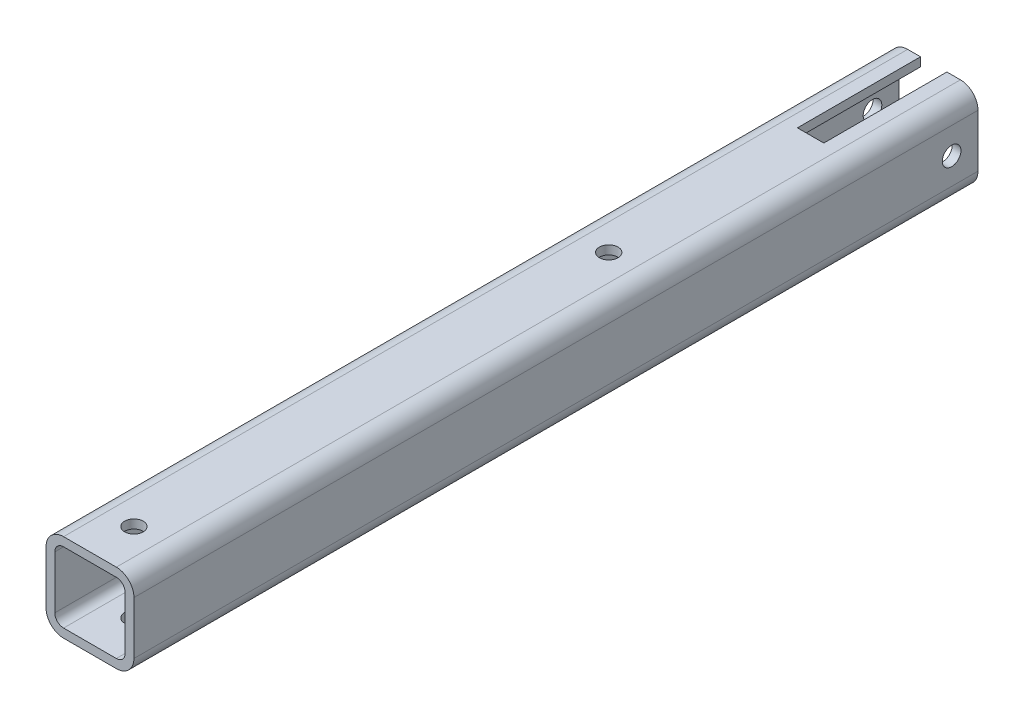
ISO-10303-21;
HEADER;
FILE_DESCRIPTION(('STEP AP214'),'2;1');
FILE_NAME('part.step','',(''),(''),'','','');
FILE_SCHEMA(('AUTOMOTIVE_DESIGN { 1 0 10303 214 1 1 1 1 }'));
ENDSEC;
DATA;
#1=APPLICATION_CONTEXT('core data for automotive mechanical design processes');
#2=APPLICATION_PROTOCOL_DEFINITION('international standard','automotive_design',2000,#1);
#3=PRODUCT_CONTEXT('',#1,'mechanical');
#4=PRODUCT('Part','Part','',(#3));
#5=PRODUCT_RELATED_PRODUCT_CATEGORY('part','',(#4));
#6=PRODUCT_DEFINITION_FORMATION('','',#4);
#7=PRODUCT_DEFINITION_CONTEXT('part definition',#1,'design');
#8=PRODUCT_DEFINITION('design','',#6,#7);
#9=PRODUCT_DEFINITION_SHAPE('','',#8);
#10=(LENGTH_UNIT() NAMED_UNIT(*) SI_UNIT(.MILLI.,.METRE.));
#11=(NAMED_UNIT(*) PLANE_ANGLE_UNIT() SI_UNIT($,.RADIAN.));
#12=(NAMED_UNIT(*) SI_UNIT($,.STERADIAN.) SOLID_ANGLE_UNIT());
#13=UNCERTAINTY_MEASURE_WITH_UNIT(LENGTH_MEASURE(1.E-05),#10,'distance_accuracy_value','');
#14=(GEOMETRIC_REPRESENTATION_CONTEXT(3) GLOBAL_UNCERTAINTY_ASSIGNED_CONTEXT((#13)) GLOBAL_UNIT_ASSIGNED_CONTEXT((#10,
#11,#12)) REPRESENTATION_CONTEXT('',''));
#15=CARTESIAN_POINT('',(0.,0.,0.));
#16=DIRECTION('',(0.,0.,1.));
#17=DIRECTION('',(1.,0.,0.));
#18=AXIS2_PLACEMENT_3D('',#15,#16,#17);
#19=CARTESIAN_POINT('',(15.875,0.,9.525));
#20=DIRECTION('',(1.,0.,0.));
#21=DIRECTION('',(0.,0.,-1.));
#22=AXIS2_PLACEMENT_3D('',#19,#20,#21);
#23=CYLINDRICAL_SURFACE('',#22,3.3655);
#24=CARTESIAN_POINT('',(12.7,0.,9.525));
#25=DIRECTION('',(1.,0.,0.));
#26=DIRECTION('',(0.,0.,-1.));
#27=AXIS2_PLACEMENT_3D('',#24,#25,#26);
#28=CIRCLE('',#27,3.3655);
#29=CARTESIAN_POINT('',(12.7,0.,6.1595));
#30=VERTEX_POINT('',#29);
#31=EDGE_CURVE('E298',#30,#30,#28,.F.);
#32=ORIENTED_EDGE('',*,*,#31,.T.);
#33=EDGE_LOOP('',(#32));
#34=FACE_BOUND('',#33,.T.);
#35=CARTESIAN_POINT('',(15.875,0.,9.525));
#36=DIRECTION('',(1.,0.,0.));
#37=DIRECTION('',(0.,0.,-1.));
#38=AXIS2_PLACEMENT_3D('',#35,#36,#37);
#39=CIRCLE('',#38,3.3655);
#40=CARTESIAN_POINT('',(15.875,0.,6.1595));
#41=VERTEX_POINT('',#40);
#42=EDGE_CURVE('E301',#41,#41,#39,.F.);
#43=ORIENTED_EDGE('',*,*,#42,.F.);
#44=EDGE_LOOP('',(#43));
#45=FACE_BOUND('',#44,.T.);
#46=ADVANCED_FACE('F16',(#34,#45),#23,.F.);
#47=CARTESIAN_POINT('',(4.63962226725964,15.875,44.45));
#48=DIRECTION('',(1.,0.,0.));
#49=DIRECTION('',(0.,0.,-1.));
#50=AXIS2_PLACEMENT_3D('',#47,#48,#49);
#51=PLANE('',#50);
#52=DIRECTION('',(0.,0.,1.));
#53=VECTOR('',#52,1.);
#54=CARTESIAN_POINT('',(4.63962226725964,12.7,0.));
#55=LINE('',#54,#53);
#56=CARTESIAN_POINT('',(4.63962226725964,12.7,0.));
#57=VERTEX_POINT('',#56);
#58=CARTESIAN_POINT('',(4.63962226725964,12.7,44.45));
#59=VERTEX_POINT('',#58);
#60=EDGE_CURVE('E272',#57,#59,#55,.T.);
#61=ORIENTED_EDGE('',*,*,#60,.T.);
#62=DIRECTION('',(0.,1.,0.));
#63=VECTOR('',#62,1.);
#64=CARTESIAN_POINT('',(4.63962226725964,15.875,44.45));
#65=LINE('',#64,#63);
#66=CARTESIAN_POINT('',(4.63962226725964,15.875,44.45));
#67=VERTEX_POINT('',#66);
#68=EDGE_CURVE('E253',#59,#67,#65,.T.);
#69=ORIENTED_EDGE('',*,*,#68,.T.);
#70=DIRECTION('',(0.,0.,1.));
#71=VECTOR('',#70,1.);
#72=CARTESIAN_POINT('',(4.63962226725964,15.875,0.));
#73=LINE('',#72,#71);
#74=CARTESIAN_POINT('',(4.63962226725964,15.875,0.));
#75=VERTEX_POINT('',#74);
#76=EDGE_CURVE('E248',#75,#67,#73,.T.);
#77=ORIENTED_EDGE('',*,*,#76,.F.);
#78=DIRECTION('',(0.,1.,0.));
#79=VECTOR('',#78,1.);
#80=CARTESIAN_POINT('',(4.63962226725964,0.,0.));
#81=LINE('',#80,#79);
#82=EDGE_CURVE('E237',#75,#57,#81,.F.);
#83=ORIENTED_EDGE('',*,*,#82,.T.);
#84=EDGE_LOOP('',(#61,#69,#77,#83));
#85=FACE_BOUND('',#84,.T.);
#86=ADVANCED_FACE('F386',(#85),#51,.F.);
#87=CARTESIAN_POINT('',(-4.88537773274036,15.875,44.45));
#88=DIRECTION('',(0.,0.,1.));
#89=DIRECTION('',(1.,0.,0.));
#90=AXIS2_PLACEMENT_3D('',#87,#88,#89);
#91=PLANE('',#90);
#92=ORIENTED_EDGE('',*,*,#68,.F.);
#93=DIRECTION('',(1.,0.,0.));
#94=VECTOR('',#93,1.);
#95=CARTESIAN_POINT('',(15.875,12.7,44.45));
#96=LINE('',#95,#94);
#97=CARTESIAN_POINT('',(-4.88537773274036,12.7,44.45));
#98=VERTEX_POINT('',#97);
#99=EDGE_CURVE('E269',#59,#98,#96,.F.);
#100=ORIENTED_EDGE('',*,*,#99,.T.);
#101=DIRECTION('',(0.,1.,0.));
#102=VECTOR('',#101,1.);
#103=CARTESIAN_POINT('',(-4.88537773274036,15.875,44.45));
#104=LINE('',#103,#102);
#105=CARTESIAN_POINT('',(-4.88537773274036,15.875,44.45));
#106=VERTEX_POINT('',#105);
#107=EDGE_CURVE('E260',#98,#106,#104,.T.);
#108=ORIENTED_EDGE('',*,*,#107,.T.);
#109=DIRECTION('',(1.,0.,0.));
#110=VECTOR('',#109,1.);
#111=CARTESIAN_POINT('',(15.875,15.875,44.45));
#112=LINE('',#111,#110);
#113=EDGE_CURVE('E257',#67,#106,#112,.F.);
#114=ORIENTED_EDGE('',*,*,#113,.F.);
#115=EDGE_LOOP('',(#92,#100,#108,#114));
#116=FACE_BOUND('',#115,.T.);
#117=ADVANCED_FACE('F392',(#116),#91,.F.);
#118=CARTESIAN_POINT('',(0.,15.875,288.925));
#119=DIRECTION('',(0.,1.,0.));
#120=DIRECTION('',(0.,0.,1.));
#121=AXIS2_PLACEMENT_3D('',#118,#119,#120);
#122=CYLINDRICAL_SURFACE('',#121,3.3655);
#123=CARTESIAN_POINT('',(0.,12.7,288.925));
#124=DIRECTION('',(0.,1.,0.));
#125=DIRECTION('',(0.,0.,1.));
#126=AXIS2_PLACEMENT_3D('',#123,#124,#125);
#127=CIRCLE('',#126,3.3655);
#128=CARTESIAN_POINT('',(0.,12.7,292.2905));
#129=VERTEX_POINT('',#128);
#130=EDGE_CURVE('E271',#129,#129,#127,.F.);
#131=ORIENTED_EDGE('',*,*,#130,.T.);
#132=EDGE_LOOP('',(#131));
#133=FACE_BOUND('',#132,.T.);
#134=CARTESIAN_POINT('',(0.,15.875,288.925));
#135=DIRECTION('',(0.,1.,0.));
#136=DIRECTION('',(0.,0.,1.));
#137=AXIS2_PLACEMENT_3D('',#134,#135,#136);
#138=CIRCLE('',#137,3.3655);
#139=CARTESIAN_POINT('',(0.,15.875,292.2905));
#140=VERTEX_POINT('',#139);
#141=EDGE_CURVE('E266',#140,#140,#138,.F.);
#142=ORIENTED_EDGE('',*,*,#141,.F.);
#143=EDGE_LOOP('',(#142));
#144=FACE_BOUND('',#143,.T.);
#145=ADVANCED_FACE('F497',(#133,#144),#122,.F.);
#146=CARTESIAN_POINT('',(0.,15.875,117.475));
#147=DIRECTION('',(0.,1.,0.));
#148=DIRECTION('',(0.,0.,1.));
#149=AXIS2_PLACEMENT_3D('',#146,#147,#148);
#150=CYLINDRICAL_SURFACE('',#149,3.3655);
#151=CARTESIAN_POINT('',(0.,12.7,117.475));
#152=DIRECTION('',(0.,1.,0.));
#153=DIRECTION('',(0.,0.,1.));
#154=AXIS2_PLACEMENT_3D('',#151,#152,#153);
#155=CIRCLE('',#154,3.3655);
#156=CARTESIAN_POINT('',(0.,12.7,120.8405));
#157=VERTEX_POINT('',#156);
#158=EDGE_CURVE('E362',#157,#157,#155,.F.);
#159=ORIENTED_EDGE('',*,*,#158,.T.);
#160=EDGE_LOOP('',(#159));
#161=FACE_BOUND('',#160,.T.);
#162=CARTESIAN_POINT('',(0.,15.875,117.475));
#163=DIRECTION('',(0.,1.,0.));
#164=DIRECTION('',(0.,0.,1.));
#165=AXIS2_PLACEMENT_3D('',#162,#163,#164);
#166=CIRCLE('',#165,3.3655);
#167=CARTESIAN_POINT('',(0.,15.875,120.8405));
#168=VERTEX_POINT('',#167);
#169=EDGE_CURVE('E357',#168,#168,#166,.F.);
#170=ORIENTED_EDGE('',*,*,#169,.F.);
#171=EDGE_LOOP('',(#170));
#172=FACE_BOUND('',#171,.T.);
#173=ADVANCED_FACE('F494',(#161,#172),#150,.F.);
#174=CARTESIAN_POINT('',(4.63962226725964,15.875,44.45));
#175=DIRECTION('',(1.,0.,0.));
#176=DIRECTION('',(0.,0.,-1.));
#177=AXIS2_PLACEMENT_3D('',#174,#175,#176);
#178=PLANE('',#177);
#179=DIRECTION('',(0.,0.,-1.));
#180=VECTOR('',#179,1.);
#181=CARTESIAN_POINT('',(4.63962226725964,-15.875,0.));
#182=LINE('',#181,#180);
#183=CARTESIAN_POINT('',(4.63962226725964,-15.875,44.45));
#184=VERTEX_POINT('',#183);
#185=CARTESIAN_POINT('',(4.63962226725964,-15.875,0.));
#186=VERTEX_POINT('',#185);
#187=EDGE_CURVE('E137',#184,#186,#182,.T.);
#188=ORIENTED_EDGE('',*,*,#187,.F.);
#189=DIRECTION('',(0.,1.,0.));
#190=VECTOR('',#189,1.);
#191=CARTESIAN_POINT('',(4.63962226725964,15.875,44.45));
#192=LINE('',#191,#190);
#193=CARTESIAN_POINT('',(4.63962226725964,-12.7,44.45));
#194=VERTEX_POINT('',#193);
#195=EDGE_CURVE('E190',#184,#194,#192,.T.);
#196=ORIENTED_EDGE('',*,*,#195,.T.);
#197=DIRECTION('',(0.,0.,-1.));
#198=VECTOR('',#197,1.);
#199=CARTESIAN_POINT('',(4.63962226725964,-12.7,0.));
#200=LINE('',#199,#198);
#201=CARTESIAN_POINT('',(4.63962226725964,-12.7,0.));
#202=VERTEX_POINT('',#201);
#203=EDGE_CURVE('E193',#194,#202,#200,.T.);
#204=ORIENTED_EDGE('',*,*,#203,.T.);
#205=DIRECTION('',(0.,1.,0.));
#206=VECTOR('',#205,1.);
#207=CARTESIAN_POINT('',(4.63962226725964,0.,0.));
#208=LINE('',#207,#206);
#209=EDGE_CURVE('E196',#202,#186,#208,.F.);
#210=ORIENTED_EDGE('',*,*,#209,.T.);
#211=EDGE_LOOP('',(#188,#196,#204,#210));
#212=FACE_BOUND('',#211,.T.);
#213=ADVANCED_FACE('F192',(#212),#178,.F.);
#214=CARTESIAN_POINT('',(0.,0.,0.));
#215=DIRECTION('',(0.,0.,1.));
#216=DIRECTION('',(1.,0.,0.));
#217=AXIS2_PLACEMENT_3D('',#214,#215,#216);
#218=PLANE('',#217);
#219=DIRECTION('',(1.,0.,0.));
#220=VECTOR('',#219,1.);
#221=CARTESIAN_POINT('',(-15.875,-12.7,0.));
#222=LINE('',#221,#220);
#223=CARTESIAN_POINT('',(9.525,-12.7,0.));
#224=VERTEX_POINT('',#223);
#225=EDGE_CURVE('E207',#202,#224,#222,.T.);
#226=ORIENTED_EDGE('',*,*,#225,.T.);
#227=CARTESIAN_POINT('',(9.525,-9.525,0.));
#228=DIRECTION('',(0.,0.,-1.));
#229=DIRECTION('',(-1.,0.,0.));
#230=AXIS2_PLACEMENT_3D('',#227,#228,#229);
#231=CIRCLE('',#230,3.175);
#232=CARTESIAN_POINT('',(12.7,-9.525,0.));
#233=VERTEX_POINT('',#232);
#234=EDGE_CURVE('E213',#224,#233,#231,.F.);
#235=ORIENTED_EDGE('',*,*,#234,.T.);
#236=DIRECTION('',(0.,1.,0.));
#237=VECTOR('',#236,1.);
#238=CARTESIAN_POINT('',(12.7,-15.875,0.));
#239=LINE('',#238,#237);
#240=CARTESIAN_POINT('',(12.7,9.525,0.));
#241=VERTEX_POINT('',#240);
#242=EDGE_CURVE('E295',#233,#241,#239,.T.);
#243=ORIENTED_EDGE('',*,*,#242,.T.);
#244=CARTESIAN_POINT('',(9.525,9.525,0.));
#245=DIRECTION('',(0.,0.,-1.));
#246=DIRECTION('',(-1.,0.,0.));
#247=AXIS2_PLACEMENT_3D('',#244,#245,#246);
#248=CIRCLE('',#247,3.175);
#249=CARTESIAN_POINT('',(9.525,12.7,0.));
#250=VERTEX_POINT('',#249);
#251=EDGE_CURVE('E375',#241,#250,#248,.F.);
#252=ORIENTED_EDGE('',*,*,#251,.T.);
#253=DIRECTION('',(1.,0.,0.));
#254=VECTOR('',#253,1.);
#255=CARTESIAN_POINT('',(15.875,12.7,0.));
#256=LINE('',#255,#254);
#257=EDGE_CURVE('E281',#250,#57,#256,.F.);
#258=ORIENTED_EDGE('',*,*,#257,.T.);
#259=ORIENTED_EDGE('',*,*,#82,.F.);
#260=DIRECTION('',(1.,0.,0.));
#261=VECTOR('',#260,1.);
#262=CARTESIAN_POINT('',(15.875,15.875,0.));
#263=LINE('',#262,#261);
#264=CARTESIAN_POINT('',(9.525,15.875,0.));
#265=VERTEX_POINT('',#264);
#266=EDGE_CURVE('E245',#265,#75,#263,.F.);
#267=ORIENTED_EDGE('',*,*,#266,.F.);
#268=CARTESIAN_POINT('',(9.525,9.525,0.));
#269=DIRECTION('',(0.,0.,-1.));
#270=DIRECTION('',(-1.,0.,0.));
#271=AXIS2_PLACEMENT_3D('',#268,#269,#270);
#272=CIRCLE('',#271,6.35);
#273=CARTESIAN_POINT('',(15.875,9.525,0.));
#274=VERTEX_POINT('',#273);
#275=EDGE_CURVE('E378',#274,#265,#272,.F.);
#276=ORIENTED_EDGE('',*,*,#275,.F.);
#277=DIRECTION('',(0.,1.,0.));
#278=VECTOR('',#277,1.);
#279=CARTESIAN_POINT('',(15.875,-15.875,0.));
#280=LINE('',#279,#278);
#281=CARTESIAN_POINT('',(15.875,-9.525,0.));
#282=VERTEX_POINT('',#281);
#283=EDGE_CURVE('E300',#282,#274,#280,.T.);
#284=ORIENTED_EDGE('',*,*,#283,.F.);
#285=CARTESIAN_POINT('',(9.525,-9.525,0.));
#286=DIRECTION('',(0.,0.,-1.));
#287=DIRECTION('',(-1.,0.,0.));
#288=AXIS2_PLACEMENT_3D('',#285,#286,#287);
#289=CIRCLE('',#288,6.35);
#290=CARTESIAN_POINT('',(9.525,-15.875,0.));
#291=VERTEX_POINT('',#290);
#292=EDGE_CURVE('E19',#291,#282,#289,.F.);
#293=ORIENTED_EDGE('',*,*,#292,.F.);
#294=DIRECTION('',(1.,0.,0.));
#295=VECTOR('',#294,1.);
#296=CARTESIAN_POINT('',(-15.875,-15.875,0.));
#297=LINE('',#296,#295);
#298=EDGE_CURVE('E129',#186,#291,#297,.T.);
#299=ORIENTED_EDGE('',*,*,#298,.F.);
#300=ORIENTED_EDGE('',*,*,#209,.F.);
#301=EDGE_LOOP('',(#226,#235,#243,#252,#258,#259,#267,#276,#284,#293,#299,#300));
#302=FACE_BOUND('',#301,.T.);
#303=ADVANCED_FACE('F487',(#302),#218,.F.);
#304=CARTESIAN_POINT('',(0.,15.875,288.925));
#305=DIRECTION('',(0.,1.,0.));
#306=DIRECTION('',(0.,0.,1.));
#307=AXIS2_PLACEMENT_3D('',#304,#305,#306);
#308=CYLINDRICAL_SURFACE('',#307,3.3655);
#309=CARTESIAN_POINT('',(0.,-12.7,288.925));
#310=DIRECTION('',(0.,1.,0.));
#311=DIRECTION('',(0.,0.,1.));
#312=AXIS2_PLACEMENT_3D('',#309,#310,#311);
#313=CIRCLE('',#312,3.3655);
#314=CARTESIAN_POINT('',(0.,-12.7,292.2905));
#315=VERTEX_POINT('',#314);
#316=EDGE_CURVE('E370',#315,#315,#313,.T.);
#317=ORIENTED_EDGE('',*,*,#316,.T.);
#318=EDGE_LOOP('',(#317));
#319=FACE_BOUND('',#318,.T.);
#320=CARTESIAN_POINT('',(0.,-15.875,288.925));
#321=DIRECTION('',(0.,1.,0.));
#322=DIRECTION('',(0.,0.,1.));
#323=AXIS2_PLACEMENT_3D('',#320,#321,#322);
#324=CIRCLE('',#323,3.3655);
#325=CARTESIAN_POINT('',(0.,-15.875,292.2905));
#326=VERTEX_POINT('',#325);
#327=EDGE_CURVE('E353',#326,#326,#324,.T.);
#328=ORIENTED_EDGE('',*,*,#327,.F.);
#329=EDGE_LOOP('',(#328));
#330=FACE_BOUND('',#329,.T.);
#331=ADVANCED_FACE('F483',(#319,#330),#308,.F.);
#332=CARTESIAN_POINT('',(0.,15.875,117.475));
#333=DIRECTION('',(0.,1.,0.));
#334=DIRECTION('',(0.,0.,1.));
#335=AXIS2_PLACEMENT_3D('',#332,#333,#334);
#336=CYLINDRICAL_SURFACE('',#335,3.3655);
#337=CARTESIAN_POINT('',(0.,-12.7,117.475));
#338=DIRECTION('',(0.,1.,0.));
#339=DIRECTION('',(0.,0.,1.));
#340=AXIS2_PLACEMENT_3D('',#337,#338,#339);
#341=CIRCLE('',#340,3.3655);
#342=CARTESIAN_POINT('',(0.,-12.7,120.8405));
#343=VERTEX_POINT('',#342);
#344=EDGE_CURVE('E367',#343,#343,#341,.T.);
#345=ORIENTED_EDGE('',*,*,#344,.T.);
#346=EDGE_LOOP('',(#345));
#347=FACE_BOUND('',#346,.T.);
#348=CARTESIAN_POINT('',(0.,-15.875,117.475));
#349=DIRECTION('',(0.,1.,0.));
#350=DIRECTION('',(0.,0.,1.));
#351=AXIS2_PLACEMENT_3D('',#348,#349,#350);
#352=CIRCLE('',#351,3.3655);
#353=CARTESIAN_POINT('',(0.,-15.875,120.8405));
#354=VERTEX_POINT('',#353);
#355=EDGE_CURVE('E350',#354,#354,#352,.T.);
#356=ORIENTED_EDGE('',*,*,#355,.F.);
#357=EDGE_LOOP('',(#356));
#358=FACE_BOUND('',#357,.T.);
#359=ADVANCED_FACE('F480',(#347,#358),#336,.F.);
#360=CARTESIAN_POINT('',(-4.88537773274036,15.875,44.45));
#361=DIRECTION('',(0.,0.,1.));
#362=DIRECTION('',(1.,0.,0.));
#363=AXIS2_PLACEMENT_3D('',#360,#361,#362);
#364=PLANE('',#363);
#365=DIRECTION('',(0.,1.,0.));
#366=VECTOR('',#365,1.);
#367=CARTESIAN_POINT('',(-4.88537773274036,15.875,44.45));
#368=LINE('',#367,#366);
#369=CARTESIAN_POINT('',(-4.88537773274036,-15.875,44.45));
#370=VERTEX_POINT('',#369);
#371=CARTESIAN_POINT('',(-4.88537773274036,-12.7,44.45));
#372=VERTEX_POINT('',#371);
#373=EDGE_CURVE('E212',#370,#372,#368,.T.);
#374=ORIENTED_EDGE('',*,*,#373,.T.);
#375=DIRECTION('',(1.,0.,0.));
#376=VECTOR('',#375,1.);
#377=CARTESIAN_POINT('',(-15.875,-12.7,44.45));
#378=LINE('',#377,#376);
#379=EDGE_CURVE('E203',#372,#194,#378,.T.);
#380=ORIENTED_EDGE('',*,*,#379,.T.);
#381=ORIENTED_EDGE('',*,*,#195,.F.);
#382=DIRECTION('',(1.,0.,0.));
#383=VECTOR('',#382,1.);
#384=CARTESIAN_POINT('',(-15.875,-15.875,44.45));
#385=LINE('',#384,#383);
#386=EDGE_CURVE('E229',#370,#184,#385,.T.);
#387=ORIENTED_EDGE('',*,*,#386,.F.);
#388=EDGE_LOOP('',(#374,#380,#381,#387));
#389=FACE_BOUND('',#388,.T.);
#390=ADVANCED_FACE('F210',(#389),#364,.F.);
#391=CARTESIAN_POINT('',(9.525,-9.525,702.13728));
#392=DIRECTION('',(0.,0.,-1.));
#393=DIRECTION('',(-1.,0.,0.));
#394=AXIS2_PLACEMENT_3D('',#391,#392,#393);
#395=CYLINDRICAL_SURFACE('',#394,6.35);
#396=CARTESIAN_POINT('',(9.525,-9.525,304.8));
#397=DIRECTION('',(0.,0.,-1.));
#398=DIRECTION('',(-1.,0.,0.));
#399=AXIS2_PLACEMENT_3D('',#396,#397,#398);
#400=CIRCLE('',#399,6.35);
#401=CARTESIAN_POINT('',(9.525,-15.875,304.8));
#402=VERTEX_POINT('',#401);
#403=CARTESIAN_POINT('',(15.875,-9.525,304.8));
#404=VERTEX_POINT('',#403);
#405=EDGE_CURVE('E341',#402,#404,#400,.F.);
#406=ORIENTED_EDGE('',*,*,#405,.F.);
#407=DIRECTION('',(0.,0.,-1.));
#408=VECTOR('',#407,1.);
#409=CARTESIAN_POINT('',(9.525,-15.875,0.));
#410=LINE('',#409,#408);
#411=EDGE_CURVE('E220',#291,#402,#410,.F.);
#412=ORIENTED_EDGE('',*,*,#411,.F.);
#413=ORIENTED_EDGE('',*,*,#292,.T.);
#414=DIRECTION('',(0.,0.,-1.));
#415=VECTOR('',#414,1.);
#416=CARTESIAN_POINT('',(15.875,-9.525,0.));
#417=LINE('',#416,#415);
#418=EDGE_CURVE('E302',#404,#282,#417,.T.);
#419=ORIENTED_EDGE('',*,*,#418,.F.);
#420=EDGE_LOOP('',(#406,#412,#413,#419));
#421=FACE_BOUND('',#420,.T.);
#422=ADVANCED_FACE('F474',(#421),#395,.T.);
#423=CARTESIAN_POINT('',(15.875,-15.875,0.));
#424=DIRECTION('',(1.,0.,0.));
#425=DIRECTION('',(0.,0.,-1.));
#426=AXIS2_PLACEMENT_3D('',#423,#424,#425);
#427=PLANE('',#426);
#428=ORIENTED_EDGE('',*,*,#42,.T.);
#429=EDGE_LOOP('',(#428));
#430=FACE_BOUND('',#429,.T.);
#431=ORIENTED_EDGE('',*,*,#418,.T.);
#432=ORIENTED_EDGE('',*,*,#283,.T.);
#433=DIRECTION('',(0.,0.,-1.));
#434=VECTOR('',#433,1.);
#435=CARTESIAN_POINT('',(15.875,9.525,702.13728));
#436=LINE('',#435,#434);
#437=CARTESIAN_POINT('',(15.875,9.525,304.8));
#438=VERTEX_POINT('',#437);
#439=EDGE_CURVE('E377',#438,#274,#436,.T.);
#440=ORIENTED_EDGE('',*,*,#439,.F.);
#441=DIRECTION('',(0.,1.,0.));
#442=VECTOR('',#441,1.);
#443=CARTESIAN_POINT('',(15.875,0.,304.8));
#444=LINE('',#443,#442);
#445=EDGE_CURVE('E340',#404,#438,#444,.T.);
#446=ORIENTED_EDGE('',*,*,#445,.F.);
#447=EDGE_LOOP('',(#431,#432,#440,#446));
#448=FACE_BOUND('',#447,.T.);
#449=ADVANCED_FACE('F382',(#430,#448),#427,.T.);
#450=CARTESIAN_POINT('',(9.525,9.525,702.13728));
#451=DIRECTION('',(0.,0.,-1.));
#452=DIRECTION('',(-1.,0.,0.));
#453=AXIS2_PLACEMENT_3D('',#450,#451,#452);
#454=CYLINDRICAL_SURFACE('',#453,6.35);
#455=CARTESIAN_POINT('',(9.525,9.525,304.8));
#456=DIRECTION('',(0.,0.,-1.));
#457=DIRECTION('',(-1.,0.,0.));
#458=AXIS2_PLACEMENT_3D('',#455,#456,#457);
#459=CIRCLE('',#458,6.35);
#460=CARTESIAN_POINT('',(9.525,15.875,304.8));
#461=VERTEX_POINT('',#460);
#462=EDGE_CURVE('E337',#438,#461,#459,.F.);
#463=ORIENTED_EDGE('',*,*,#462,.F.);
#464=ORIENTED_EDGE('',*,*,#439,.T.);
#465=ORIENTED_EDGE('',*,*,#275,.T.);
#466=DIRECTION('',(0.,0.,1.));
#467=VECTOR('',#466,1.);
#468=CARTESIAN_POINT('',(9.525,15.875,0.));
#469=LINE('',#468,#467);
#470=EDGE_CURVE('E249',#461,#265,#469,.F.);
#471=ORIENTED_EDGE('',*,*,#470,.F.);
#472=EDGE_LOOP('',(#463,#464,#465,#471));
#473=FACE_BOUND('',#472,.T.);
#474=ADVANCED_FACE('F467',(#473),#454,.T.);
#475=CARTESIAN_POINT('',(9.525,9.525,702.13728));
#476=DIRECTION('',(0.,0.,-1.));
#477=DIRECTION('',(-1.,0.,0.));
#478=AXIS2_PLACEMENT_3D('',#475,#476,#477);
#479=CYLINDRICAL_SURFACE('',#478,3.175);
#480=DIRECTION('',(0.,0.,-1.));
#481=VECTOR('',#480,1.);
#482=CARTESIAN_POINT('',(12.7,9.525,0.));
#483=LINE('',#482,#481);
#484=CARTESIAN_POINT('',(12.7,9.525,304.8));
#485=VERTEX_POINT('',#484);
#486=EDGE_CURVE('E299',#241,#485,#483,.F.);
#487=ORIENTED_EDGE('',*,*,#486,.T.);
#488=CARTESIAN_POINT('',(9.525,9.525,304.8));
#489=DIRECTION('',(0.,0.,-1.));
#490=DIRECTION('',(-1.,0.,0.));
#491=AXIS2_PLACEMENT_3D('',#488,#489,#490);
#492=CIRCLE('',#491,3.175);
#493=CARTESIAN_POINT('',(9.525,12.7,304.8));
#494=VERTEX_POINT('',#493);
#495=EDGE_CURVE('E331',#494,#485,#492,.T.);
#496=ORIENTED_EDGE('',*,*,#495,.F.);
#497=DIRECTION('',(0.,0.,1.));
#498=VECTOR('',#497,1.);
#499=CARTESIAN_POINT('',(9.525,12.7,0.));
#500=LINE('',#499,#498);
#501=EDGE_CURVE('E286',#494,#250,#500,.F.);
#502=ORIENTED_EDGE('',*,*,#501,.T.);
#503=ORIENTED_EDGE('',*,*,#251,.F.);
#504=EDGE_LOOP('',(#487,#496,#502,#503));
#505=FACE_BOUND('',#504,.T.);
#506=ADVANCED_FACE('F463',(#505),#479,.F.);
#507=CARTESIAN_POINT('',(12.7,-15.875,0.));
#508=DIRECTION('',(1.,0.,0.));
#509=DIRECTION('',(0.,0.,-1.));
#510=AXIS2_PLACEMENT_3D('',#507,#508,#509);
#511=PLANE('',#510);
#512=ORIENTED_EDGE('',*,*,#31,.F.);
#513=EDGE_LOOP('',(#512));
#514=FACE_BOUND('',#513,.T.);
#515=DIRECTION('',(0.,0.,-1.));
#516=VECTOR('',#515,1.);
#517=CARTESIAN_POINT('',(12.7,-9.525,702.13728));
#518=LINE('',#517,#516);
#519=CARTESIAN_POINT('',(12.7,-9.525,304.8));
#520=VERTEX_POINT('',#519);
#521=EDGE_CURVE('E216',#233,#520,#518,.F.);
#522=ORIENTED_EDGE('',*,*,#521,.T.);
#523=DIRECTION('',(0.,1.,0.));
#524=VECTOR('',#523,1.);
#525=CARTESIAN_POINT('',(12.7,0.,304.8));
#526=LINE('',#525,#524);
#527=EDGE_CURVE('E330',#485,#520,#526,.F.);
#528=ORIENTED_EDGE('',*,*,#527,.F.);
#529=ORIENTED_EDGE('',*,*,#486,.F.);
#530=ORIENTED_EDGE('',*,*,#242,.F.);
#531=EDGE_LOOP('',(#522,#528,#529,#530));
#532=FACE_BOUND('',#531,.T.);
#533=ADVANCED_FACE('F459',(#514,#532),#511,.F.);
#534=CARTESIAN_POINT('',(9.525,-9.525,702.13728));
#535=DIRECTION('',(0.,0.,-1.));
#536=DIRECTION('',(-1.,0.,0.));
#537=AXIS2_PLACEMENT_3D('',#534,#535,#536);
#538=CYLINDRICAL_SURFACE('',#537,3.175);
#539=DIRECTION('',(0.,0.,-1.));
#540=VECTOR('',#539,1.);
#541=CARTESIAN_POINT('',(9.525,-12.7,0.));
#542=LINE('',#541,#540);
#543=CARTESIAN_POINT('',(9.525,-12.7,304.8));
#544=VERTEX_POINT('',#543);
#545=EDGE_CURVE('E290',#224,#544,#542,.F.);
#546=ORIENTED_EDGE('',*,*,#545,.T.);
#547=CARTESIAN_POINT('',(9.525,-9.525,304.8));
#548=DIRECTION('',(0.,0.,-1.));
#549=DIRECTION('',(-1.,0.,0.));
#550=AXIS2_PLACEMENT_3D('',#547,#548,#549);
#551=CIRCLE('',#550,3.175);
#552=EDGE_CURVE('E327',#520,#544,#551,.T.);
#553=ORIENTED_EDGE('',*,*,#552,.F.);
#554=ORIENTED_EDGE('',*,*,#521,.F.);
#555=ORIENTED_EDGE('',*,*,#234,.F.);
#556=EDGE_LOOP('',(#546,#553,#554,#555));
#557=FACE_BOUND('',#556,.T.);
#558=ADVANCED_FACE('F455',(#557),#538,.F.);
#559=CARTESIAN_POINT('',(-15.875,-12.7,0.));
#560=DIRECTION('',(0.,-1.,0.));
#561=DIRECTION('',(0.,0.,-1.));
#562=AXIS2_PLACEMENT_3D('',#559,#560,#561);
#563=PLANE('',#562);
#564=ORIENTED_EDGE('',*,*,#344,.F.);
#565=EDGE_LOOP('',(#564));
#566=FACE_BOUND('',#565,.T.);
#567=ORIENTED_EDGE('',*,*,#316,.F.);
#568=EDGE_LOOP('',(#567));
#569=FACE_BOUND('',#568,.T.);
#570=DIRECTION('',(1.,0.,0.));
#571=VECTOR('',#570,1.);
#572=CARTESIAN_POINT('',(0.,-12.7,0.));
#573=LINE('',#572,#571);
#574=CARTESIAN_POINT('',(-4.88537773274036,-12.7,0.));
#575=VERTEX_POINT('',#574);
#576=CARTESIAN_POINT('',(-9.525,-12.7,0.));
#577=VERTEX_POINT('',#576);
#578=EDGE_CURVE('E322',#575,#577,#573,.F.);
#579=ORIENTED_EDGE('',*,*,#578,.T.);
#580=DIRECTION('',(0.,0.,-1.));
#581=VECTOR('',#580,1.);
#582=CARTESIAN_POINT('',(-9.525,-12.7,702.13728));
#583=LINE('',#582,#581);
#584=CARTESIAN_POINT('',(-9.525,-12.7,304.8));
#585=VERTEX_POINT('',#584);
#586=EDGE_CURVE('E349',#577,#585,#583,.F.);
#587=ORIENTED_EDGE('',*,*,#586,.T.);
#588=DIRECTION('',(1.,0.,0.));
#589=VECTOR('',#588,1.);
#590=CARTESIAN_POINT('',(0.,-12.7,304.8));
#591=LINE('',#590,#589);
#592=EDGE_CURVE('E336',#544,#585,#591,.F.);
#593=ORIENTED_EDGE('',*,*,#592,.F.);
#594=ORIENTED_EDGE('',*,*,#545,.F.);
#595=ORIENTED_EDGE('',*,*,#225,.F.);
#596=ORIENTED_EDGE('',*,*,#203,.F.);
#597=ORIENTED_EDGE('',*,*,#379,.F.);
#598=DIRECTION('',(0.,0.,1.));
#599=VECTOR('',#598,1.);
#600=CARTESIAN_POINT('',(-4.88537773274036,-12.7,0.));
#601=LINE('',#600,#599);
#602=EDGE_CURVE('E225',#372,#575,#601,.F.);
#603=ORIENTED_EDGE('',*,*,#602,.T.);
#604=EDGE_LOOP('',(#579,#587,#593,#594,#595,#596,#597,#603));
#605=FACE_BOUND('',#604,.T.);
#606=ADVANCED_FACE('F201',(#566,#569,#605),#563,.F.);
#607=CARTESIAN_POINT('',(15.875,12.7,0.));
#608=DIRECTION('',(0.,1.,0.));
#609=DIRECTION('',(0.,0.,1.));
#610=AXIS2_PLACEMENT_3D('',#607,#608,#609);
#611=PLANE('',#610);
#612=ORIENTED_EDGE('',*,*,#158,.F.);
#613=EDGE_LOOP('',(#612));
#614=FACE_BOUND('',#613,.T.);
#615=ORIENTED_EDGE('',*,*,#130,.F.);
#616=EDGE_LOOP('',(#615));
#617=FACE_BOUND('',#616,.T.);
#618=ORIENTED_EDGE('',*,*,#99,.F.);
#619=ORIENTED_EDGE('',*,*,#60,.F.);
#620=ORIENTED_EDGE('',*,*,#257,.F.);
#621=ORIENTED_EDGE('',*,*,#501,.F.);
#622=DIRECTION('',(1.,0.,0.));
#623=VECTOR('',#622,1.);
#624=CARTESIAN_POINT('',(0.,12.7,304.8));
#625=LINE('',#624,#623);
#626=CARTESIAN_POINT('',(-9.525,12.7,304.8));
#627=VERTEX_POINT('',#626);
#628=EDGE_CURVE('E333',#627,#494,#625,.T.);
#629=ORIENTED_EDGE('',*,*,#628,.F.);
#630=DIRECTION('',(0.,0.,-1.));
#631=VECTOR('',#630,1.);
#632=CARTESIAN_POINT('',(-9.525,12.7,702.13728));
#633=LINE('',#632,#631);
#634=CARTESIAN_POINT('',(-9.525,12.7,0.));
#635=VERTEX_POINT('',#634);
#636=EDGE_CURVE('E326',#627,#635,#633,.T.);
#637=ORIENTED_EDGE('',*,*,#636,.T.);
#638=DIRECTION('',(1.,0.,0.));
#639=VECTOR('',#638,1.);
#640=CARTESIAN_POINT('',(0.,12.7,0.));
#641=LINE('',#640,#639);
#642=CARTESIAN_POINT('',(-4.88537773274036,12.7,0.));
#643=VERTEX_POINT('',#642);
#644=EDGE_CURVE('E318',#635,#643,#641,.T.);
#645=ORIENTED_EDGE('',*,*,#644,.T.);
#646=DIRECTION('',(0.,0.,1.));
#647=VECTOR('',#646,1.);
#648=CARTESIAN_POINT('',(-4.88537773274036,12.7,0.));
#649=LINE('',#648,#647);
#650=EDGE_CURVE('E262',#643,#98,#649,.T.);
#651=ORIENTED_EDGE('',*,*,#650,.T.);
#652=EDGE_LOOP('',(#618,#619,#620,#621,#629,#637,#645,#651));
#653=FACE_BOUND('',#652,.T.);
#654=ADVANCED_FACE('F448',(#614,#617,#653),#611,.F.);
#655=CARTESIAN_POINT('',(-4.88537773274036,15.875,0.));
#656=DIRECTION('',(-1.,0.,0.));
#657=DIRECTION('',(0.,0.,1.));
#658=AXIS2_PLACEMENT_3D('',#655,#656,#657);
#659=PLANE('',#658);
#660=DIRECTION('',(0.,0.,1.));
#661=VECTOR('',#660,1.);
#662=CARTESIAN_POINT('',(-4.88537773274036,15.875,0.));
#663=LINE('',#662,#661);
#664=CARTESIAN_POINT('',(-4.88537773274036,15.875,0.));
#665=VERTEX_POINT('',#664);
#666=EDGE_CURVE('E176',#106,#665,#663,.F.);
#667=ORIENTED_EDGE('',*,*,#666,.F.);
#668=ORIENTED_EDGE('',*,*,#107,.F.);
#669=ORIENTED_EDGE('',*,*,#650,.F.);
#670=DIRECTION('',(0.,1.,0.));
#671=VECTOR('',#670,1.);
#672=CARTESIAN_POINT('',(-4.88537773274036,0.,0.));
#673=LINE('',#672,#671);
#674=EDGE_CURVE('E561',#643,#665,#673,.T.);
#675=ORIENTED_EDGE('',*,*,#674,.T.);
#676=EDGE_LOOP('',(#667,#668,#669,#675));
#677=FACE_BOUND('',#676,.T.);
#678=ADVANCED_FACE('F444',(#677),#659,.F.);
#679=CARTESIAN_POINT('',(15.875,15.875,0.));
#680=DIRECTION('',(0.,1.,0.));
#681=DIRECTION('',(0.,0.,1.));
#682=AXIS2_PLACEMENT_3D('',#679,#680,#681);
#683=PLANE('',#682);
#684=ORIENTED_EDGE('',*,*,#169,.T.);
#685=EDGE_LOOP('',(#684));
#686=FACE_BOUND('',#685,.T.);
#687=ORIENTED_EDGE('',*,*,#141,.T.);
#688=EDGE_LOOP('',(#687));
#689=FACE_BOUND('',#688,.T.);
#690=ORIENTED_EDGE('',*,*,#76,.T.);
#691=ORIENTED_EDGE('',*,*,#113,.T.);
#692=ORIENTED_EDGE('',*,*,#666,.T.);
#693=DIRECTION('',(1.,0.,0.));
#694=VECTOR('',#693,1.);
#695=CARTESIAN_POINT('',(0.,15.875,0.));
#696=LINE('',#695,#694);
#697=CARTESIAN_POINT('',(-9.525,15.875,0.));
#698=VERTEX_POINT('',#697);
#699=EDGE_CURVE('E316',#665,#698,#696,.F.);
#700=ORIENTED_EDGE('',*,*,#699,.T.);
#701=DIRECTION('',(0.,0.,-1.));
#702=VECTOR('',#701,1.);
#703=CARTESIAN_POINT('',(-9.525,15.875,702.13728));
#704=LINE('',#703,#702);
#705=CARTESIAN_POINT('',(-9.525,15.875,304.8));
#706=VERTEX_POINT('',#705);
#707=EDGE_CURVE('E167',#706,#698,#704,.T.);
#708=ORIENTED_EDGE('',*,*,#707,.F.);
#709=DIRECTION('',(1.,0.,0.));
#710=VECTOR('',#709,1.);
#711=CARTESIAN_POINT('',(0.,15.875,304.8));
#712=LINE('',#711,#710);
#713=EDGE_CURVE('E339',#461,#706,#712,.F.);
#714=ORIENTED_EDGE('',*,*,#713,.F.);
#715=ORIENTED_EDGE('',*,*,#470,.T.);
#716=ORIENTED_EDGE('',*,*,#266,.T.);
#717=EDGE_LOOP('',(#690,#691,#692,#700,#708,#714,#715,#716));
#718=FACE_BOUND('',#717,.T.);
#719=ADVANCED_FACE('F441',(#686,#689,#718),#683,.T.);
#720=CARTESIAN_POINT('',(-9.525,9.525,702.13728));
#721=DIRECTION('',(0.,0.,-1.));
#722=DIRECTION('',(-1.,0.,0.));
#723=AXIS2_PLACEMENT_3D('',#720,#721,#722);
#724=CYLINDRICAL_SURFACE('',#723,6.35);
#725=CARTESIAN_POINT('',(-9.525,9.525,304.8));
#726=DIRECTION('',(0.,0.,-1.));
#727=DIRECTION('',(-1.,0.,0.));
#728=AXIS2_PLACEMENT_3D('',#725,#726,#727);
#729=CIRCLE('',#728,6.35);
#730=CARTESIAN_POINT('',(-15.875,9.525,304.8));
#731=VERTEX_POINT('',#730);
#732=EDGE_CURVE('E347',#706,#731,#729,.F.);
#733=ORIENTED_EDGE('',*,*,#732,.F.);
#734=ORIENTED_EDGE('',*,*,#707,.T.);
#735=CARTESIAN_POINT('',(-9.525,9.525,0.));
#736=DIRECTION('',(0.,0.,-1.));
#737=DIRECTION('',(-1.,0.,0.));
#738=AXIS2_PLACEMENT_3D('',#735,#736,#737);
#739=CIRCLE('',#738,6.35);
#740=CARTESIAN_POINT('',(-15.875,9.525,0.));
#741=VERTEX_POINT('',#740);
#742=EDGE_CURVE('E314',#698,#741,#739,.F.);
#743=ORIENTED_EDGE('',*,*,#742,.T.);
#744=DIRECTION('',(0.,0.,1.));
#745=VECTOR('',#744,1.);
#746=CARTESIAN_POINT('',(-15.875,9.525,0.));
#747=LINE('',#746,#745);
#748=EDGE_CURVE('E554',#731,#741,#747,.F.);
#749=ORIENTED_EDGE('',*,*,#748,.F.);
#750=EDGE_LOOP('',(#733,#734,#743,#749));
#751=FACE_BOUND('',#750,.T.);
#752=ADVANCED_FACE('F437',(#751),#724,.T.);
#753=CARTESIAN_POINT('',(-9.525,-9.525,702.13728));
#754=DIRECTION('',(0.,0.,-1.));
#755=DIRECTION('',(-1.,0.,0.));
#756=AXIS2_PLACEMENT_3D('',#753,#754,#755);
#757=CYLINDRICAL_SURFACE('',#756,6.35);
#758=CARTESIAN_POINT('',(-9.525,-9.525,304.8));
#759=DIRECTION('',(0.,0.,-1.));
#760=DIRECTION('',(-1.,0.,0.));
#761=AXIS2_PLACEMENT_3D('',#758,#759,#760);
#762=CIRCLE('',#761,6.35);
#763=CARTESIAN_POINT('',(-15.875,-9.525,304.8));
#764=VERTEX_POINT('',#763);
#765=CARTESIAN_POINT('',(-9.525,-15.875,304.8));
#766=VERTEX_POINT('',#765);
#767=EDGE_CURVE('E344',#764,#766,#762,.F.);
#768=ORIENTED_EDGE('',*,*,#767,.F.);
#769=DIRECTION('',(0.,0.,1.));
#770=VECTOR('',#769,1.);
#771=CARTESIAN_POINT('',(-15.875,-9.525,0.));
#772=LINE('',#771,#770);
#773=CARTESIAN_POINT('',(-15.875,-9.525,0.));
#774=VERTEX_POINT('',#773);
#775=EDGE_CURVE('E556',#774,#764,#772,.T.);
#776=ORIENTED_EDGE('',*,*,#775,.F.);
#777=CARTESIAN_POINT('',(-9.525,-9.525,0.));
#778=DIRECTION('',(0.,0.,-1.));
#779=DIRECTION('',(-1.,0.,0.));
#780=AXIS2_PLACEMENT_3D('',#777,#778,#779);
#781=CIRCLE('',#780,6.35);
#782=CARTESIAN_POINT('',(-9.525,-15.875,0.));
#783=VERTEX_POINT('',#782);
#784=EDGE_CURVE('E309',#774,#783,#781,.F.);
#785=ORIENTED_EDGE('',*,*,#784,.T.);
#786=DIRECTION('',(0.,0.,-1.));
#787=VECTOR('',#786,1.);
#788=CARTESIAN_POINT('',(-9.525,-15.875,0.));
#789=LINE('',#788,#787);
#790=EDGE_CURVE('E356',#766,#783,#789,.T.);
#791=ORIENTED_EDGE('',*,*,#790,.F.);
#792=EDGE_LOOP('',(#768,#776,#785,#791));
#793=FACE_BOUND('',#792,.T.);
#794=ADVANCED_FACE('F433',(#793),#757,.T.);
#795=CARTESIAN_POINT('',(-15.875,-15.875,0.));
#796=DIRECTION('',(0.,-1.,0.));
#797=DIRECTION('',(0.,0.,-1.));
#798=AXIS2_PLACEMENT_3D('',#795,#796,#797);
#799=PLANE('',#798);
#800=ORIENTED_EDGE('',*,*,#355,.T.);
#801=EDGE_LOOP('',(#800));
#802=FACE_BOUND('',#801,.T.);
#803=ORIENTED_EDGE('',*,*,#327,.T.);
#804=EDGE_LOOP('',(#803));
#805=FACE_BOUND('',#804,.T.);
#806=ORIENTED_EDGE('',*,*,#790,.T.);
#807=DIRECTION('',(1.,0.,0.));
#808=VECTOR('',#807,1.);
#809=CARTESIAN_POINT('',(0.,-15.875,0.));
#810=LINE('',#809,#808);
#811=CARTESIAN_POINT('',(-4.88537773274036,-15.875,0.));
#812=VERTEX_POINT('',#811);
#813=EDGE_CURVE('E312',#783,#812,#810,.T.);
#814=ORIENTED_EDGE('',*,*,#813,.T.);
#815=DIRECTION('',(0.,0.,1.));
#816=VECTOR('',#815,1.);
#817=CARTESIAN_POINT('',(-4.88537773274036,-15.875,0.));
#818=LINE('',#817,#816);
#819=EDGE_CURVE('E226',#812,#370,#818,.T.);
#820=ORIENTED_EDGE('',*,*,#819,.T.);
#821=ORIENTED_EDGE('',*,*,#386,.T.);
#822=ORIENTED_EDGE('',*,*,#187,.T.);
#823=ORIENTED_EDGE('',*,*,#298,.T.);
#824=ORIENTED_EDGE('',*,*,#411,.T.);
#825=DIRECTION('',(1.,0.,0.));
#826=VECTOR('',#825,1.);
#827=CARTESIAN_POINT('',(0.,-15.875,304.8));
#828=LINE('',#827,#826);
#829=EDGE_CURVE('E343',#766,#402,#828,.T.);
#830=ORIENTED_EDGE('',*,*,#829,.F.);
#831=EDGE_LOOP('',(#806,#814,#820,#821,#822,#823,#824,#830));
#832=FACE_BOUND('',#831,.T.);
#833=ADVANCED_FACE('F429',(#802,#805,#832),#799,.T.);
#834=CARTESIAN_POINT('',(-4.88537773274036,15.875,0.));
#835=DIRECTION('',(-1.,0.,0.));
#836=DIRECTION('',(0.,0.,1.));
#837=AXIS2_PLACEMENT_3D('',#834,#835,#836);
#838=PLANE('',#837);
#839=ORIENTED_EDGE('',*,*,#602,.F.);
#840=ORIENTED_EDGE('',*,*,#373,.F.);
#841=ORIENTED_EDGE('',*,*,#819,.F.);
#842=DIRECTION('',(0.,1.,0.));
#843=VECTOR('',#842,1.);
#844=CARTESIAN_POINT('',(-4.88537773274036,0.,0.));
#845=LINE('',#844,#843);
#846=EDGE_CURVE('E308',#812,#575,#845,.T.);
#847=ORIENTED_EDGE('',*,*,#846,.T.);
#848=EDGE_LOOP('',(#839,#840,#841,#847));
#849=FACE_BOUND('',#848,.T.);
#850=ADVANCED_FACE('F425',(#849),#838,.F.);
#851=CARTESIAN_POINT('',(-15.875,15.875,0.));
#852=DIRECTION('',(-1.,0.,0.));
#853=DIRECTION('',(0.,0.,1.));
#854=AXIS2_PLACEMENT_3D('',#851,#852,#853);
#855=PLANE('',#854);
#856=CARTESIAN_POINT('',(-15.875,0.,9.525));
#857=DIRECTION('',(1.,0.,0.));
#858=DIRECTION('',(0.,0.,-1.));
#859=AXIS2_PLACEMENT_3D('',#856,#857,#858);
#860=CIRCLE('',#859,3.3655);
#861=CARTESIAN_POINT('',(-15.875,0.,6.1595));
#862=VERTEX_POINT('',#861);
#863=EDGE_CURVE('E304',#862,#862,#860,.T.);
#864=ORIENTED_EDGE('',*,*,#863,.T.);
#865=EDGE_LOOP('',(#864));
#866=FACE_BOUND('',#865,.T.);
#867=ORIENTED_EDGE('',*,*,#775,.T.);
#868=DIRECTION('',(0.,1.,0.));
#869=VECTOR('',#868,1.);
#870=CARTESIAN_POINT('',(-15.875,0.,304.8));
#871=LINE('',#870,#869);
#872=EDGE_CURVE('E346',#731,#764,#871,.F.);
#873=ORIENTED_EDGE('',*,*,#872,.F.);
#874=ORIENTED_EDGE('',*,*,#748,.T.);
#875=DIRECTION('',(0.,1.,0.));
#876=VECTOR('',#875,1.);
#877=CARTESIAN_POINT('',(-15.875,0.,0.));
#878=LINE('',#877,#876);
#879=EDGE_CURVE('E313',#741,#774,#878,.F.);
#880=ORIENTED_EDGE('',*,*,#879,.T.);
#881=EDGE_LOOP('',(#867,#873,#874,#880));
#882=FACE_BOUND('',#881,.T.);
#883=ADVANCED_FACE('F421',(#866,#882),#855,.T.);
#884=CARTESIAN_POINT('',(-9.525,-9.525,702.13728));
#885=DIRECTION('',(0.,0.,-1.));
#886=DIRECTION('',(-1.,0.,0.));
#887=AXIS2_PLACEMENT_3D('',#884,#885,#886);
#888=CYLINDRICAL_SURFACE('',#887,3.175);
#889=DIRECTION('',(0.,0.,1.));
#890=VECTOR('',#889,1.);
#891=CARTESIAN_POINT('',(-12.7,-9.525,0.));
#892=LINE('',#891,#890);
#893=CARTESIAN_POINT('',(-12.7,-9.525,0.));
#894=VERTEX_POINT('',#893);
#895=CARTESIAN_POINT('',(-12.7,-9.525,304.8));
#896=VERTEX_POINT('',#895);
#897=EDGE_CURVE('E307',#894,#896,#892,.T.);
#898=ORIENTED_EDGE('',*,*,#897,.T.);
#899=CARTESIAN_POINT('',(-9.525,-9.525,304.8));
#900=DIRECTION('',(0.,0.,-1.));
#901=DIRECTION('',(-1.,0.,0.));
#902=AXIS2_PLACEMENT_3D('',#899,#900,#901);
#903=CIRCLE('',#902,3.175);
#904=EDGE_CURVE('E334',#585,#896,#903,.T.);
#905=ORIENTED_EDGE('',*,*,#904,.F.);
#906=ORIENTED_EDGE('',*,*,#586,.F.);
#907=CARTESIAN_POINT('',(-9.525,-9.525,0.));
#908=DIRECTION('',(0.,0.,-1.));
#909=DIRECTION('',(-1.,0.,0.));
#910=AXIS2_PLACEMENT_3D('',#907,#908,#909);
#911=CIRCLE('',#910,3.175);
#912=EDGE_CURVE('E319',#577,#894,#911,.T.);
#913=ORIENTED_EDGE('',*,*,#912,.T.);
#914=EDGE_LOOP('',(#898,#905,#906,#913));
#915=FACE_BOUND('',#914,.T.);
#916=ADVANCED_FACE('F417',(#915),#888,.F.);
#917=CARTESIAN_POINT('',(0.,0.,304.8));
#918=DIRECTION('',(0.,0.,1.));
#919=DIRECTION('',(1.,0.,0.));
#920=AXIS2_PLACEMENT_3D('',#917,#918,#919);
#921=PLANE('',#920);
#922=ORIENTED_EDGE('',*,*,#527,.T.);
#923=ORIENTED_EDGE('',*,*,#552,.T.);
#924=ORIENTED_EDGE('',*,*,#592,.T.);
#925=ORIENTED_EDGE('',*,*,#904,.T.);
#926=DIRECTION('',(0.,1.,0.));
#927=VECTOR('',#926,1.);
#928=CARTESIAN_POINT('',(-12.7,15.875,304.8));
#929=LINE('',#928,#927);
#930=CARTESIAN_POINT('',(-12.7,9.525,304.8));
#931=VERTEX_POINT('',#930);
#932=EDGE_CURVE('E594',#896,#931,#929,.T.);
#933=ORIENTED_EDGE('',*,*,#932,.T.);
#934=CARTESIAN_POINT('',(-9.525,9.525,304.8));
#935=DIRECTION('',(0.,0.,-1.));
#936=DIRECTION('',(-1.,0.,0.));
#937=AXIS2_PLACEMENT_3D('',#934,#935,#936);
#938=CIRCLE('',#937,3.175);
#939=EDGE_CURVE('E323',#931,#627,#938,.T.);
#940=ORIENTED_EDGE('',*,*,#939,.T.);
#941=ORIENTED_EDGE('',*,*,#628,.T.);
#942=ORIENTED_EDGE('',*,*,#495,.T.);
#943=EDGE_LOOP('',(#922,#923,#924,#925,#933,#940,#941,#942));
#944=FACE_BOUND('',#943,.T.);
#945=ORIENTED_EDGE('',*,*,#462,.T.);
#946=ORIENTED_EDGE('',*,*,#713,.T.);
#947=ORIENTED_EDGE('',*,*,#732,.T.);
#948=ORIENTED_EDGE('',*,*,#872,.T.);
#949=ORIENTED_EDGE('',*,*,#767,.T.);
#950=ORIENTED_EDGE('',*,*,#829,.T.);
#951=ORIENTED_EDGE('',*,*,#405,.T.);
#952=ORIENTED_EDGE('',*,*,#445,.T.);
#953=EDGE_LOOP('',(#945,#946,#947,#948,#949,#950,#951,#952));
#954=FACE_BOUND('',#953,.T.);
#955=ADVANCED_FACE('F413',(#944,#954),#921,.T.);
#956=CARTESIAN_POINT('',(-9.525,9.525,702.13728));
#957=DIRECTION('',(0.,0.,-1.));
#958=DIRECTION('',(-1.,0.,0.));
#959=AXIS2_PLACEMENT_3D('',#956,#957,#958);
#960=CYLINDRICAL_SURFACE('',#959,3.175);
#961=ORIENTED_EDGE('',*,*,#636,.F.);
#962=ORIENTED_EDGE('',*,*,#939,.F.);
#963=DIRECTION('',(0.,0.,1.));
#964=VECTOR('',#963,1.);
#965=CARTESIAN_POINT('',(-12.7,9.525,0.));
#966=LINE('',#965,#964);
#967=CARTESIAN_POINT('',(-12.7,9.525,0.));
#968=VERTEX_POINT('',#967);
#969=EDGE_CURVE('E596',#931,#968,#966,.F.);
#970=ORIENTED_EDGE('',*,*,#969,.T.);
#971=CARTESIAN_POINT('',(-9.525,9.525,0.));
#972=DIRECTION('',(0.,0.,-1.));
#973=DIRECTION('',(-1.,0.,0.));
#974=AXIS2_PLACEMENT_3D('',#971,#972,#973);
#975=CIRCLE('',#974,3.175);
#976=EDGE_CURVE('E34',#968,#635,#975,.T.);
#977=ORIENTED_EDGE('',*,*,#976,.T.);
#978=EDGE_LOOP('',(#961,#962,#970,#977));
#979=FACE_BOUND('',#978,.T.);
#980=ADVANCED_FACE('F410',(#979),#960,.F.);
#981=CARTESIAN_POINT('',(0.,0.,0.));
#982=DIRECTION('',(0.,0.,1.));
#983=DIRECTION('',(1.,0.,0.));
#984=AXIS2_PLACEMENT_3D('',#981,#982,#983);
#985=PLANE('',#984);
#986=ORIENTED_EDGE('',*,*,#813,.F.);
#987=ORIENTED_EDGE('',*,*,#784,.F.);
#988=ORIENTED_EDGE('',*,*,#879,.F.);
#989=ORIENTED_EDGE('',*,*,#742,.F.);
#990=ORIENTED_EDGE('',*,*,#699,.F.);
#991=ORIENTED_EDGE('',*,*,#674,.F.);
#992=ORIENTED_EDGE('',*,*,#644,.F.);
#993=ORIENTED_EDGE('',*,*,#976,.F.);
#994=DIRECTION('',(0.,1.,0.));
#995=VECTOR('',#994,1.);
#996=CARTESIAN_POINT('',(-12.7,15.875,0.));
#997=LINE('',#996,#995);
#998=EDGE_CURVE('E25',#968,#894,#997,.F.);
#999=ORIENTED_EDGE('',*,*,#998,.T.);
#1000=ORIENTED_EDGE('',*,*,#912,.F.);
#1001=ORIENTED_EDGE('',*,*,#578,.F.);
#1002=ORIENTED_EDGE('',*,*,#846,.F.);
#1003=EDGE_LOOP('',(#986,#987,#988,#989,#990,#991,#992,#993,#999,#1000,#1001,#1002));
#1004=FACE_BOUND('',#1003,.T.);
#1005=ADVANCED_FACE('F402',(#1004),#985,.F.);
#1006=CARTESIAN_POINT('',(15.875,0.,9.525));
#1007=DIRECTION('',(1.,0.,0.));
#1008=DIRECTION('',(0.,0.,-1.));
#1009=AXIS2_PLACEMENT_3D('',#1006,#1007,#1008);
#1010=CYLINDRICAL_SURFACE('',#1009,3.3655);
#1011=CARTESIAN_POINT('',(-12.7,0.,9.525));
#1012=DIRECTION('',(1.,0.,0.));
#1013=DIRECTION('',(0.,0.,-1.));
#1014=AXIS2_PLACEMENT_3D('',#1011,#1012,#1013);
#1015=CIRCLE('',#1014,3.3655);
#1016=CARTESIAN_POINT('',(-12.7,0.,6.1595));
#1017=VERTEX_POINT('',#1016);
#1018=EDGE_CURVE('E11',#1017,#1017,#1015,.T.);
#1019=ORIENTED_EDGE('',*,*,#1018,.T.);
#1020=EDGE_LOOP('',(#1019));
#1021=FACE_BOUND('',#1020,.T.);
#1022=ORIENTED_EDGE('',*,*,#863,.F.);
#1023=EDGE_LOOP('',(#1022));
#1024=FACE_BOUND('',#1023,.T.);
#1025=ADVANCED_FACE('F396',(#1021,#1024),#1010,.F.);
#1026=CARTESIAN_POINT('',(-12.7,15.875,0.));
#1027=DIRECTION('',(-1.,0.,0.));
#1028=DIRECTION('',(0.,0.,1.));
#1029=AXIS2_PLACEMENT_3D('',#1026,#1027,#1028);
#1030=PLANE('',#1029);
#1031=ORIENTED_EDGE('',*,*,#1018,.F.);
#1032=EDGE_LOOP('',(#1031));
#1033=FACE_BOUND('',#1032,.T.);
#1034=ORIENTED_EDGE('',*,*,#969,.F.);
#1035=ORIENTED_EDGE('',*,*,#932,.F.);
#1036=ORIENTED_EDGE('',*,*,#897,.F.);
#1037=ORIENTED_EDGE('',*,*,#998,.F.);
#1038=EDGE_LOOP('',(#1034,#1035,#1036,#1037));
#1039=FACE_BOUND('',#1038,.T.);
#1040=ADVANCED_FACE('F394',(#1033,#1039),#1030,.F.);
#1041=CLOSED_SHELL('',(#46,#86,#117,#145,#173,#213,#303,#331,#359,#390,#422,#449,#474,#506,#533,
#558,#606,#654,#678,#719,#752,#794,#833,#850,#883,#916,#955,#980,#1005,#1025,#1040));
#1042=MANIFOLD_SOLID_BREP('B1',#1041);
#1043=ADVANCED_BREP_SHAPE_REPRESENTATION('',(#18,#1042),#14);
#1044=SHAPE_DEFINITION_REPRESENTATION(#9,#1043);
ENDSEC;
END-ISO-10303-21;
